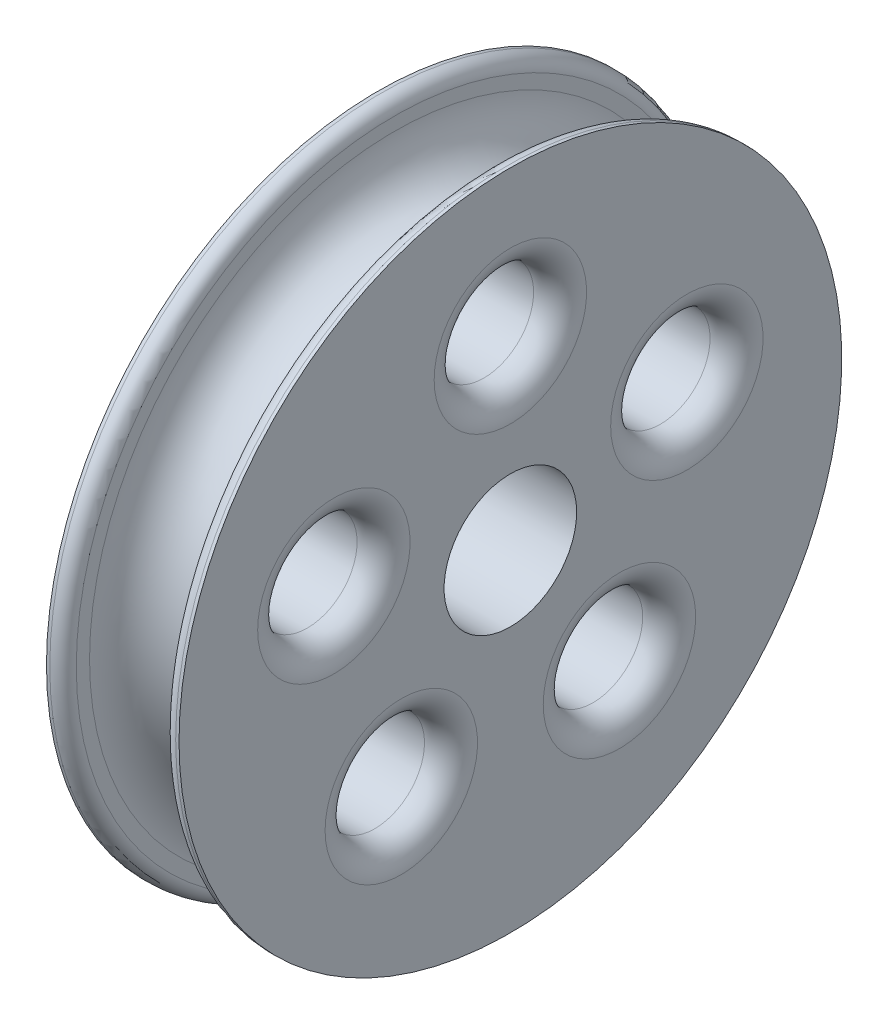
ISO-10303-21;
HEADER;
FILE_DESCRIPTION(('STEP AP214'),'2;1');
FILE_NAME('part.step','',(''),(''),'','','');
FILE_SCHEMA(('AUTOMOTIVE_DESIGN { 1 0 10303 214 1 1 1 1 }'));
ENDSEC;
DATA;
#1=APPLICATION_CONTEXT('core data for automotive mechanical design processes');
#2=APPLICATION_PROTOCOL_DEFINITION('international standard','automotive_design',2000,#1);
#3=PRODUCT_CONTEXT('',#1,'mechanical');
#4=PRODUCT('Part','Part','',(#3));
#5=PRODUCT_RELATED_PRODUCT_CATEGORY('part','',(#4));
#6=PRODUCT_DEFINITION_FORMATION('','',#4);
#7=PRODUCT_DEFINITION_CONTEXT('part definition',#1,'design');
#8=PRODUCT_DEFINITION('design','',#6,#7);
#9=PRODUCT_DEFINITION_SHAPE('','',#8);
#10=(LENGTH_UNIT() NAMED_UNIT(*) SI_UNIT(.MILLI.,.METRE.));
#11=(NAMED_UNIT(*) PLANE_ANGLE_UNIT() SI_UNIT($,.RADIAN.));
#12=(NAMED_UNIT(*) SI_UNIT($,.STERADIAN.) SOLID_ANGLE_UNIT());
#13=UNCERTAINTY_MEASURE_WITH_UNIT(LENGTH_MEASURE(1.E-05),#10,'distance_accuracy_value','');
#14=(GEOMETRIC_REPRESENTATION_CONTEXT(3) GLOBAL_UNCERTAINTY_ASSIGNED_CONTEXT((#13)) GLOBAL_UNIT_ASSIGNED_CONTEXT((#10,
#11,#12)) REPRESENTATION_CONTEXT('',''));
#15=CARTESIAN_POINT('',(0.,0.,0.));
#16=DIRECTION('',(0.,0.,1.));
#17=DIRECTION('',(1.,0.,0.));
#18=AXIS2_PLACEMENT_3D('',#15,#16,#17);
#19=CARTESIAN_POINT('',(-12.7,0.,0.));
#20=DIRECTION('',(1.,0.,0.));
#21=DIRECTION('',(0.,0.,-1.));
#22=AXIS2_PLACEMENT_3D('',#19,#20,#21);
#23=PLANE('',#22);
#24=CARTESIAN_POINT('',(-12.7,0.,0.));
#25=DIRECTION('',(1.,0.,0.));
#26=DIRECTION('',(0.,0.,-1.));
#27=AXIS2_PLACEMENT_3D('',#24,#25,#26);
#28=CIRCLE('',#27,12.7);
#29=CARTESIAN_POINT('',(-12.7,0.,-12.7));
#30=VERTEX_POINT('',#29);
#31=EDGE_CURVE('E157',#30,#30,#28,.T.);
#32=ORIENTED_EDGE('',*,*,#31,.T.);
#33=EDGE_LOOP('',(#32));
#34=FACE_BOUND('',#33,.T.);
#35=CARTESIAN_POINT('',(-12.7,10.9886443199717,33.8195697194546));
#36=DIRECTION('',(1.,0.,0.));
#37=DIRECTION('',(0.,0.,-1.));
#38=AXIS2_PLACEMENT_3D('',#35,#36,#37);
#39=CIRCLE('',#38,14.605);
#40=CARTESIAN_POINT('',(-12.7,10.9886443199717,19.2145697194546));
#41=VERTEX_POINT('',#40);
#42=EDGE_CURVE('E93',#41,#41,#39,.T.);
#43=ORIENTED_EDGE('',*,*,#42,.T.);
#44=EDGE_LOOP('',(#43));
#45=FACE_BOUND('',#44,.T.);
#46=CARTESIAN_POINT('',(-12.7,-28.768644319974,20.9016435715176));
#47=DIRECTION('',(1.,0.,0.));
#48=DIRECTION('',(0.,0.,-1.));
#49=AXIS2_PLACEMENT_3D('',#46,#47,#48);
#50=CIRCLE('',#49,14.605);
#51=CARTESIAN_POINT('',(-12.7,-28.768644319974,6.29664357151761));
#52=VERTEX_POINT('',#51);
#53=EDGE_CURVE('E97',#52,#52,#50,.T.);
#54=ORIENTED_EDGE('',*,*,#53,.T.);
#55=EDGE_LOOP('',(#54));
#56=FACE_BOUND('',#55,.T.);
#57=CARTESIAN_POINT('',(-12.7,-28.7686443199722,-20.9016435715231));
#58=DIRECTION('',(1.,0.,0.));
#59=DIRECTION('',(0.,0.,-1.));
#60=AXIS2_PLACEMENT_3D('',#57,#58,#59);
#61=CIRCLE('',#60,14.605);
#62=CARTESIAN_POINT('',(-12.7,-28.7686443199722,-35.5066435715231));
#63=VERTEX_POINT('',#62);
#64=EDGE_CURVE('E101',#63,#63,#61,.T.);
#65=ORIENTED_EDGE('',*,*,#64,.T.);
#66=EDGE_LOOP('',(#65));
#67=FACE_BOUND('',#66,.T.);
#68=CARTESIAN_POINT('',(-12.7,10.9886443199746,-33.8195697194567));
#69=DIRECTION('',(1.,0.,0.));
#70=DIRECTION('',(0.,0.,-1.));
#71=AXIS2_PLACEMENT_3D('',#68,#69,#70);
#72=CIRCLE('',#71,14.605);
#73=CARTESIAN_POINT('',(-12.7,10.9886443199746,-48.4245697194567));
#74=VERTEX_POINT('',#73);
#75=EDGE_CURVE('E105',#74,#74,#72,.T.);
#76=ORIENTED_EDGE('',*,*,#75,.T.);
#77=EDGE_LOOP('',(#76));
#78=FACE_BOUND('',#77,.T.);
#79=CARTESIAN_POINT('',(-12.7,35.56,0.));
#80=DIRECTION('',(1.,0.,0.));
#81=DIRECTION('',(0.,0.,-1.));
#82=AXIS2_PLACEMENT_3D('',#79,#80,#81);
#83=CIRCLE('',#82,14.605);
#84=CARTESIAN_POINT('',(-12.7,35.56,-14.605));
#85=VERTEX_POINT('',#84);
#86=EDGE_CURVE('E109',#85,#85,#83,.T.);
#87=ORIENTED_EDGE('',*,*,#86,.T.);
#88=EDGE_LOOP('',(#87));
#89=FACE_BOUND('',#88,.T.);
#90=CARTESIAN_POINT('',(-12.7,0.,0.));
#91=DIRECTION('',(-1.,0.,0.));
#92=DIRECTION('',(0.,0.,1.));
#93=AXIS2_PLACEMENT_3D('',#90,#91,#92);
#94=CIRCLE('',#93,63.5);
#95=CARTESIAN_POINT('',(-12.7,0.,63.5));
#96=VERTEX_POINT('',#95);
#97=EDGE_CURVE('E153',#96,#96,#94,.T.);
#98=ORIENTED_EDGE('',*,*,#97,.T.);
#99=EDGE_LOOP('',(#98));
#100=FACE_BOUND('',#99,.T.);
#101=ADVANCED_FACE('F37',(#34,#45,#56,#67,#78,#89,#100),#23,.F.);
#102=CARTESIAN_POINT('',(12.7,0.,0.));
#103=DIRECTION('',(-1.,0.,0.));
#104=DIRECTION('',(0.,0.,1.));
#105=AXIS2_PLACEMENT_3D('',#102,#103,#104);
#106=PLANE('',#105);
#107=CARTESIAN_POINT('',(12.7,0.,0.));
#108=DIRECTION('',(1.,0.,0.));
#109=DIRECTION('',(0.,0.,-1.));
#110=AXIS2_PLACEMENT_3D('',#107,#108,#109);
#111=CIRCLE('',#110,12.7);
#112=CARTESIAN_POINT('',(12.7,0.,-12.7));
#113=VERTEX_POINT('',#112);
#114=EDGE_CURVE('E158',#113,#113,#111,.T.);
#115=ORIENTED_EDGE('',*,*,#114,.F.);
#116=EDGE_LOOP('',(#115));
#117=FACE_BOUND('',#116,.T.);
#118=CARTESIAN_POINT('',(12.7,10.9886443199717,33.8195697194546));
#119=DIRECTION('',(-1.,0.,0.));
#120=DIRECTION('',(0.,0.,1.));
#121=AXIS2_PLACEMENT_3D('',#118,#119,#120);
#122=CIRCLE('',#121,14.605);
#123=CARTESIAN_POINT('',(12.7,10.9886443199717,48.4245697194546));
#124=VERTEX_POINT('',#123);
#125=EDGE_CURVE('E113',#124,#124,#122,.T.);
#126=ORIENTED_EDGE('',*,*,#125,.T.);
#127=EDGE_LOOP('',(#126));
#128=FACE_BOUND('',#127,.T.);
#129=CARTESIAN_POINT('',(12.7,-28.768644319974,20.9016435715176));
#130=DIRECTION('',(-1.,0.,0.));
#131=DIRECTION('',(0.,0.,1.));
#132=AXIS2_PLACEMENT_3D('',#129,#130,#131);
#133=CIRCLE('',#132,14.605);
#134=CARTESIAN_POINT('',(12.7,-28.768644319974,35.5066435715176));
#135=VERTEX_POINT('',#134);
#136=EDGE_CURVE('E117',#135,#135,#133,.T.);
#137=ORIENTED_EDGE('',*,*,#136,.T.);
#138=EDGE_LOOP('',(#137));
#139=FACE_BOUND('',#138,.T.);
#140=CARTESIAN_POINT('',(12.7,-28.7686443199722,-20.9016435715231));
#141=DIRECTION('',(-1.,0.,0.));
#142=DIRECTION('',(0.,0.,1.));
#143=AXIS2_PLACEMENT_3D('',#140,#141,#142);
#144=CIRCLE('',#143,14.605);
#145=CARTESIAN_POINT('',(12.7,-28.7686443199722,-6.29664357152308));
#146=VERTEX_POINT('',#145);
#147=EDGE_CURVE('E121',#146,#146,#144,.T.);
#148=ORIENTED_EDGE('',*,*,#147,.T.);
#149=EDGE_LOOP('',(#148));
#150=FACE_BOUND('',#149,.T.);
#151=CARTESIAN_POINT('',(12.7,10.9886443199746,-33.8195697194567));
#152=DIRECTION('',(-1.,0.,0.));
#153=DIRECTION('',(0.,0.,1.));
#154=AXIS2_PLACEMENT_3D('',#151,#152,#153);
#155=CIRCLE('',#154,14.605);
#156=CARTESIAN_POINT('',(12.7,10.9886443199746,-19.2145697194567));
#157=VERTEX_POINT('',#156);
#158=EDGE_CURVE('E125',#157,#157,#155,.T.);
#159=ORIENTED_EDGE('',*,*,#158,.T.);
#160=EDGE_LOOP('',(#159));
#161=FACE_BOUND('',#160,.T.);
#162=CARTESIAN_POINT('',(12.7,35.56,0.));
#163=DIRECTION('',(-1.,0.,0.));
#164=DIRECTION('',(0.,0.,1.));
#165=AXIS2_PLACEMENT_3D('',#162,#163,#164);
#166=CIRCLE('',#165,14.605);
#167=CARTESIAN_POINT('',(12.7,35.56,14.605));
#168=VERTEX_POINT('',#167);
#169=EDGE_CURVE('E129',#168,#168,#166,.T.);
#170=ORIENTED_EDGE('',*,*,#169,.T.);
#171=EDGE_LOOP('',(#170));
#172=FACE_BOUND('',#171,.T.);
#173=CARTESIAN_POINT('',(12.7,0.,0.));
#174=DIRECTION('',(-1.,0.,0.));
#175=DIRECTION('',(0.,0.,1.));
#176=AXIS2_PLACEMENT_3D('',#173,#174,#175);
#177=CIRCLE('',#176,63.5);
#178=CARTESIAN_POINT('',(12.7,0.,63.5));
#179=VERTEX_POINT('',#178);
#180=EDGE_CURVE('E141',#179,#179,#177,.T.);
#181=ORIENTED_EDGE('',*,*,#180,.F.);
#182=EDGE_LOOP('',(#181));
#183=FACE_BOUND('',#182,.T.);
#184=ADVANCED_FACE('F174',(#117,#128,#139,#150,#161,#172,#183),#106,.F.);
#185=CARTESIAN_POINT('',(-12.7,0.,0.));
#186=DIRECTION('',(-1.,0.,0.));
#187=DIRECTION('',(0.,0.,1.));
#188=AXIS2_PLACEMENT_3D('',#185,#186,#187);
#189=CYLINDRICAL_SURFACE('',#188,63.5);
#190=CARTESIAN_POINT('',(12.065,0.,0.));
#191=DIRECTION('',(1.,0.,0.));
#192=DIRECTION('',(0.,0.,-1.));
#193=AXIS2_PLACEMENT_3D('',#190,#191,#192);
#194=CIRCLE('',#193,63.5);
#195=CARTESIAN_POINT('',(12.065,0.,-63.5));
#196=VERTEX_POINT('',#195);
#197=EDGE_CURVE('E10',#196,#196,#194,.T.);
#198=ORIENTED_EDGE('',*,*,#197,.T.);
#199=EDGE_LOOP('',(#198));
#200=FACE_BOUND('',#199,.T.);
#201=ORIENTED_EDGE('',*,*,#180,.T.);
#202=EDGE_LOOP('',(#201));
#203=FACE_BOUND('',#202,.T.);
#204=ADVANCED_FACE('F177',(#200,#203),#189,.T.);
#205=CARTESIAN_POINT('',(9.525,58.42,0.));
#206=DIRECTION('',(1.,0.,0.));
#207=DIRECTION('',(0.,0.,-1.));
#208=AXIS2_PLACEMENT_3D('',#205,#206,#207);
#209=PLANE('',#208);
#210=CARTESIAN_POINT('',(9.525,0.,0.));
#211=DIRECTION('',(1.,0.,0.));
#212=DIRECTION('',(0.,0.,-1.));
#213=AXIS2_PLACEMENT_3D('',#210,#211,#212);
#214=CIRCLE('',#213,60.96);
#215=CARTESIAN_POINT('',(9.525,0.,-60.96));
#216=VERTEX_POINT('',#215);
#217=EDGE_CURVE('E45',#216,#216,#214,.F.);
#218=ORIENTED_EDGE('',*,*,#217,.T.);
#219=EDGE_LOOP('',(#218));
#220=FACE_BOUND('',#219,.T.);
#221=CARTESIAN_POINT('',(9.525,0.,0.));
#222=DIRECTION('',(-1.,0.,0.));
#223=DIRECTION('',(0.,0.,1.));
#224=AXIS2_PLACEMENT_3D('',#221,#222,#223);
#225=CIRCLE('',#224,58.42);
#226=CARTESIAN_POINT('',(9.525,0.,58.42));
#227=VERTEX_POINT('',#226);
#228=EDGE_CURVE('E145',#227,#227,#225,.T.);
#229=ORIENTED_EDGE('',*,*,#228,.F.);
#230=EDGE_LOOP('',(#229));
#231=FACE_BOUND('',#230,.T.);
#232=ADVANCED_FACE('F192',(#220,#231),#209,.F.);
#233=CARTESIAN_POINT('',(0.,0.,0.));
#234=DIRECTION('',(-1.,0.,0.));
#235=DIRECTION('',(0.,0.,1.));
#236=AXIS2_PLACEMENT_3D('',#233,#234,#235);
#237=TOROIDAL_SURFACE('',#236,58.42,9.525);
#238=CARTESIAN_POINT('',(-9.52499999999999,0.,0.));
#239=DIRECTION('',(-1.,0.,0.));
#240=DIRECTION('',(0.,0.,1.));
#241=AXIS2_PLACEMENT_3D('',#238,#239,#240);
#242=CIRCLE('',#241,58.42);
#243=CARTESIAN_POINT('',(-9.52499999999999,0.,58.42));
#244=VERTEX_POINT('',#243);
#245=EDGE_CURVE('E149',#244,#244,#242,.T.);
#246=ORIENTED_EDGE('',*,*,#245,.F.);
#247=EDGE_LOOP('',(#246));
#248=FACE_BOUND('',#247,.T.);
#249=ORIENTED_EDGE('',*,*,#228,.T.);
#250=EDGE_LOOP('',(#249));
#251=FACE_BOUND('',#250,.T.);
#252=ADVANCED_FACE('F197',(#248,#251),#237,.F.);
#253=CARTESIAN_POINT('',(-9.52499999999999,58.42,0.));
#254=DIRECTION('',(-1.,0.,0.));
#255=DIRECTION('',(0.,0.,1.));
#256=AXIS2_PLACEMENT_3D('',#253,#254,#255);
#257=PLANE('',#256);
#258=CARTESIAN_POINT('',(-9.52499999999999,0.,0.));
#259=DIRECTION('',(-1.,0.,0.));
#260=DIRECTION('',(0.,0.,1.));
#261=AXIS2_PLACEMENT_3D('',#258,#259,#260);
#262=CIRCLE('',#261,60.96);
#263=CARTESIAN_POINT('',(-9.52499999999999,0.,60.96));
#264=VERTEX_POINT('',#263);
#265=EDGE_CURVE('E50',#264,#264,#262,.F.);
#266=ORIENTED_EDGE('',*,*,#265,.T.);
#267=EDGE_LOOP('',(#266));
#268=FACE_BOUND('',#267,.T.);
#269=ORIENTED_EDGE('',*,*,#245,.T.);
#270=EDGE_LOOP('',(#269));
#271=FACE_BOUND('',#270,.T.);
#272=ADVANCED_FACE('F259',(#268,#271),#257,.F.);
#273=CARTESIAN_POINT('',(-12.7,0.,0.));
#274=DIRECTION('',(-1.,0.,0.));
#275=DIRECTION('',(0.,0.,1.));
#276=AXIS2_PLACEMENT_3D('',#273,#274,#275);
#277=CYLINDRICAL_SURFACE('',#276,63.5);
#278=CARTESIAN_POINT('',(-12.065,0.,0.));
#279=DIRECTION('',(-1.,0.,0.));
#280=DIRECTION('',(0.,0.,1.));
#281=AXIS2_PLACEMENT_3D('',#278,#279,#280);
#282=CIRCLE('',#281,63.5);
#283=CARTESIAN_POINT('',(-12.065,0.,63.5));
#284=VERTEX_POINT('',#283);
#285=EDGE_CURVE('E55',#284,#284,#282,.T.);
#286=ORIENTED_EDGE('',*,*,#285,.T.);
#287=EDGE_LOOP('',(#286));
#288=FACE_BOUND('',#287,.T.);
#289=ORIENTED_EDGE('',*,*,#97,.F.);
#290=EDGE_LOOP('',(#289));
#291=FACE_BOUND('',#290,.T.);
#292=ADVANCED_FACE('F255',(#288,#291),#277,.T.);
#293=CARTESIAN_POINT('',(-12.7,10.9886443199717,33.8195697194546));
#294=DIRECTION('',(1.,0.,0.));
#295=DIRECTION('',(0.,0.,-1.));
#296=AXIS2_PLACEMENT_3D('',#293,#294,#295);
#297=CYLINDRICAL_SURFACE('',#296,9.52500000000001);
#298=CARTESIAN_POINT('',(7.62,10.9886443199717,33.8195697194546));
#299=DIRECTION('',(-1.,0.,0.));
#300=DIRECTION('',(0.,0.,1.));
#301=AXIS2_PLACEMENT_3D('',#298,#299,#300);
#302=CIRCLE('',#301,9.52500000000001);
#303=CARTESIAN_POINT('',(7.62,10.9886443199717,43.3445697194546));
#304=VERTEX_POINT('',#303);
#305=EDGE_CURVE('E133',#304,#304,#302,.F.);
#306=ORIENTED_EDGE('',*,*,#305,.T.);
#307=EDGE_LOOP('',(#306));
#308=FACE_BOUND('',#307,.T.);
#309=CARTESIAN_POINT('',(-7.62,10.9886443199717,33.8195697194546));
#310=DIRECTION('',(1.,0.,0.));
#311=DIRECTION('',(0.,0.,-1.));
#312=AXIS2_PLACEMENT_3D('',#309,#310,#311);
#313=CIRCLE('',#312,9.52500000000001);
#314=CARTESIAN_POINT('',(-7.62,10.9886443199717,24.2945697194546));
#315=VERTEX_POINT('',#314);
#316=EDGE_CURVE('E137',#315,#315,#313,.F.);
#317=ORIENTED_EDGE('',*,*,#316,.T.);
#318=EDGE_LOOP('',(#317));
#319=FACE_BOUND('',#318,.T.);
#320=ADVANCED_FACE('F258',(#308,#319),#297,.F.);
#321=CARTESIAN_POINT('',(-12.7,-28.768644319974,20.9016435715176));
#322=DIRECTION('',(1.,0.,0.));
#323=DIRECTION('',(0.,0.,-1.));
#324=AXIS2_PLACEMENT_3D('',#321,#322,#323);
#325=CYLINDRICAL_SURFACE('',#324,9.525);
#326=CARTESIAN_POINT('',(7.62,-28.768644319974,20.9016435715176));
#327=DIRECTION('',(-1.,0.,0.));
#328=DIRECTION('',(0.,0.,1.));
#329=AXIS2_PLACEMENT_3D('',#326,#327,#328);
#330=CIRCLE('',#329,9.525);
#331=CARTESIAN_POINT('',(7.62,-28.768644319974,30.4266435715176));
#332=VERTEX_POINT('',#331);
#333=EDGE_CURVE('E85',#332,#332,#330,.F.);
#334=ORIENTED_EDGE('',*,*,#333,.T.);
#335=EDGE_LOOP('',(#334));
#336=FACE_BOUND('',#335,.T.);
#337=CARTESIAN_POINT('',(-7.62,-28.768644319974,20.9016435715176));
#338=DIRECTION('',(1.,0.,0.));
#339=DIRECTION('',(0.,0.,-1.));
#340=AXIS2_PLACEMENT_3D('',#337,#338,#339);
#341=CIRCLE('',#340,9.525);
#342=CARTESIAN_POINT('',(-7.62,-28.768644319974,11.3766435715176));
#343=VERTEX_POINT('',#342);
#344=EDGE_CURVE('E89',#343,#343,#341,.F.);
#345=ORIENTED_EDGE('',*,*,#344,.T.);
#346=EDGE_LOOP('',(#345));
#347=FACE_BOUND('',#346,.T.);
#348=ADVANCED_FACE('F267',(#336,#347),#325,.F.);
#349=CARTESIAN_POINT('',(-12.7,-28.7686443199722,-20.9016435715231));
#350=DIRECTION('',(1.,0.,0.));
#351=DIRECTION('',(0.,0.,-1.));
#352=AXIS2_PLACEMENT_3D('',#349,#350,#351);
#353=CYLINDRICAL_SURFACE('',#352,9.525);
#354=CARTESIAN_POINT('',(7.62,-28.7686443199722,-20.9016435715231));
#355=DIRECTION('',(-1.,0.,0.));
#356=DIRECTION('',(0.,0.,1.));
#357=AXIS2_PLACEMENT_3D('',#354,#355,#356);
#358=CIRCLE('',#357,9.525);
#359=CARTESIAN_POINT('',(7.62,-28.7686443199722,-11.3766435715231));
#360=VERTEX_POINT('',#359);
#361=EDGE_CURVE('E77',#360,#360,#358,.F.);
#362=ORIENTED_EDGE('',*,*,#361,.T.);
#363=EDGE_LOOP('',(#362));
#364=FACE_BOUND('',#363,.T.);
#365=CARTESIAN_POINT('',(-7.62,-28.7686443199722,-20.9016435715231));
#366=DIRECTION('',(1.,0.,0.));
#367=DIRECTION('',(0.,0.,-1.));
#368=AXIS2_PLACEMENT_3D('',#365,#366,#367);
#369=CIRCLE('',#368,9.525);
#370=CARTESIAN_POINT('',(-7.62,-28.7686443199722,-30.4266435715231));
#371=VERTEX_POINT('',#370);
#372=EDGE_CURVE('E81',#371,#371,#369,.F.);
#373=ORIENTED_EDGE('',*,*,#372,.T.);
#374=EDGE_LOOP('',(#373));
#375=FACE_BOUND('',#374,.T.);
#376=ADVANCED_FACE('F410',(#364,#375),#353,.F.);
#377=CARTESIAN_POINT('',(-12.7,10.9886443199746,-33.8195697194567));
#378=DIRECTION('',(1.,0.,0.));
#379=DIRECTION('',(0.,0.,-1.));
#380=AXIS2_PLACEMENT_3D('',#377,#378,#379);
#381=CYLINDRICAL_SURFACE('',#380,9.52500000000001);
#382=CARTESIAN_POINT('',(7.62,10.9886443199746,-33.8195697194567));
#383=DIRECTION('',(-1.,0.,0.));
#384=DIRECTION('',(0.,0.,1.));
#385=AXIS2_PLACEMENT_3D('',#382,#383,#384);
#386=CIRCLE('',#385,9.52500000000001);
#387=CARTESIAN_POINT('',(7.62,10.9886443199746,-24.2945697194567));
#388=VERTEX_POINT('',#387);
#389=EDGE_CURVE('E69',#388,#388,#386,.F.);
#390=ORIENTED_EDGE('',*,*,#389,.T.);
#391=EDGE_LOOP('',(#390));
#392=FACE_BOUND('',#391,.T.);
#393=CARTESIAN_POINT('',(-7.62,10.9886443199746,-33.8195697194567));
#394=DIRECTION('',(1.,0.,0.));
#395=DIRECTION('',(0.,0.,-1.));
#396=AXIS2_PLACEMENT_3D('',#393,#394,#395);
#397=CIRCLE('',#396,9.52500000000001);
#398=CARTESIAN_POINT('',(-7.62,10.9886443199746,-43.3445697194567));
#399=VERTEX_POINT('',#398);
#400=EDGE_CURVE('E73',#399,#399,#397,.F.);
#401=ORIENTED_EDGE('',*,*,#400,.T.);
#402=EDGE_LOOP('',(#401));
#403=FACE_BOUND('',#402,.T.);
#404=ADVANCED_FACE('F400',(#392,#403),#381,.F.);
#405=CARTESIAN_POINT('',(-12.7,35.56,0.));
#406=DIRECTION('',(1.,0.,0.));
#407=DIRECTION('',(0.,0.,-1.));
#408=AXIS2_PLACEMENT_3D('',#405,#406,#407);
#409=CYLINDRICAL_SURFACE('',#408,9.525);
#410=CARTESIAN_POINT('',(7.62,35.56,0.));
#411=DIRECTION('',(-1.,0.,0.));
#412=DIRECTION('',(0.,0.,1.));
#413=AXIS2_PLACEMENT_3D('',#410,#411,#412);
#414=CIRCLE('',#413,9.525);
#415=CARTESIAN_POINT('',(7.62,35.56,9.52499999999999));
#416=VERTEX_POINT('',#415);
#417=EDGE_CURVE('E61',#416,#416,#414,.F.);
#418=ORIENTED_EDGE('',*,*,#417,.T.);
#419=EDGE_LOOP('',(#418));
#420=FACE_BOUND('',#419,.T.);
#421=CARTESIAN_POINT('',(-7.62,35.56,0.));
#422=DIRECTION('',(1.,0.,0.));
#423=DIRECTION('',(0.,0.,-1.));
#424=AXIS2_PLACEMENT_3D('',#421,#422,#423);
#425=CIRCLE('',#424,9.525);
#426=CARTESIAN_POINT('',(-7.62,35.56,-9.525));
#427=VERTEX_POINT('',#426);
#428=EDGE_CURVE('E65',#427,#427,#425,.F.);
#429=ORIENTED_EDGE('',*,*,#428,.T.);
#430=EDGE_LOOP('',(#429));
#431=FACE_BOUND('',#430,.T.);
#432=ADVANCED_FACE('F208',(#420,#431),#409,.F.);
#433=CARTESIAN_POINT('',(7.62,10.9886443199717,33.8195697194546));
#434=DIRECTION('',(-1.,0.,0.));
#435=DIRECTION('',(0.,0.,1.));
#436=AXIS2_PLACEMENT_3D('',#433,#434,#435);
#437=TOROIDAL_SURFACE('',#436,14.605,5.08);
#438=ORIENTED_EDGE('',*,*,#125,.F.);
#439=EDGE_LOOP('',(#438));
#440=FACE_BOUND('',#439,.T.);
#441=ORIENTED_EDGE('',*,*,#305,.F.);
#442=EDGE_LOOP('',(#441));
#443=FACE_BOUND('',#442,.T.);
#444=ADVANCED_FACE('F204',(#440,#443),#437,.T.);
#445=CARTESIAN_POINT('',(-7.62,10.9886443199717,33.8195697194546));
#446=DIRECTION('',(1.,0.,0.));
#447=DIRECTION('',(0.,0.,-1.));
#448=AXIS2_PLACEMENT_3D('',#445,#446,#447);
#449=TOROIDAL_SURFACE('',#448,14.605,5.08);
#450=ORIENTED_EDGE('',*,*,#316,.F.);
#451=EDGE_LOOP('',(#450));
#452=FACE_BOUND('',#451,.T.);
#453=ORIENTED_EDGE('',*,*,#42,.F.);
#454=EDGE_LOOP('',(#453));
#455=FACE_BOUND('',#454,.T.);
#456=ADVANCED_FACE('F207',(#452,#455),#449,.T.);
#457=CARTESIAN_POINT('',(7.62,-28.768644319974,20.9016435715176));
#458=DIRECTION('',(-1.,0.,0.));
#459=DIRECTION('',(0.,0.,1.));
#460=AXIS2_PLACEMENT_3D('',#457,#458,#459);
#461=TOROIDAL_SURFACE('',#460,14.605,5.08);
#462=ORIENTED_EDGE('',*,*,#136,.F.);
#463=EDGE_LOOP('',(#462));
#464=FACE_BOUND('',#463,.T.);
#465=ORIENTED_EDGE('',*,*,#333,.F.);
#466=EDGE_LOOP('',(#465));
#467=FACE_BOUND('',#466,.T.);
#468=ADVANCED_FACE('F212',(#464,#467),#461,.T.);
#469=CARTESIAN_POINT('',(-7.62,-28.768644319974,20.9016435715176));
#470=DIRECTION('',(1.,0.,0.));
#471=DIRECTION('',(0.,0.,-1.));
#472=AXIS2_PLACEMENT_3D('',#469,#470,#471);
#473=TOROIDAL_SURFACE('',#472,14.605,5.08);
#474=ORIENTED_EDGE('',*,*,#344,.F.);
#475=EDGE_LOOP('',(#474));
#476=FACE_BOUND('',#475,.T.);
#477=ORIENTED_EDGE('',*,*,#53,.F.);
#478=EDGE_LOOP('',(#477));
#479=FACE_BOUND('',#478,.T.);
#480=ADVANCED_FACE('F216',(#476,#479),#473,.T.);
#481=CARTESIAN_POINT('',(7.62,-28.7686443199722,-20.9016435715231));
#482=DIRECTION('',(-1.,0.,0.));
#483=DIRECTION('',(0.,0.,1.));
#484=AXIS2_PLACEMENT_3D('',#481,#482,#483);
#485=TOROIDAL_SURFACE('',#484,14.605,5.08);
#486=ORIENTED_EDGE('',*,*,#147,.F.);
#487=EDGE_LOOP('',(#486));
#488=FACE_BOUND('',#487,.T.);
#489=ORIENTED_EDGE('',*,*,#361,.F.);
#490=EDGE_LOOP('',(#489));
#491=FACE_BOUND('',#490,.T.);
#492=ADVANCED_FACE('F220',(#488,#491),#485,.T.);
#493=CARTESIAN_POINT('',(-7.62,-28.7686443199722,-20.9016435715231));
#494=DIRECTION('',(1.,0.,0.));
#495=DIRECTION('',(0.,0.,-1.));
#496=AXIS2_PLACEMENT_3D('',#493,#494,#495);
#497=TOROIDAL_SURFACE('',#496,14.605,5.08);
#498=ORIENTED_EDGE('',*,*,#372,.F.);
#499=EDGE_LOOP('',(#498));
#500=FACE_BOUND('',#499,.T.);
#501=ORIENTED_EDGE('',*,*,#64,.F.);
#502=EDGE_LOOP('',(#501));
#503=FACE_BOUND('',#502,.T.);
#504=ADVANCED_FACE('F224',(#500,#503),#497,.T.);
#505=CARTESIAN_POINT('',(7.62,10.9886443199746,-33.8195697194567));
#506=DIRECTION('',(-1.,0.,0.));
#507=DIRECTION('',(0.,0.,1.));
#508=AXIS2_PLACEMENT_3D('',#505,#506,#507);
#509=TOROIDAL_SURFACE('',#508,14.605,5.08);
#510=ORIENTED_EDGE('',*,*,#158,.F.);
#511=EDGE_LOOP('',(#510));
#512=FACE_BOUND('',#511,.T.);
#513=ORIENTED_EDGE('',*,*,#389,.F.);
#514=EDGE_LOOP('',(#513));
#515=FACE_BOUND('',#514,.T.);
#516=ADVANCED_FACE('F228',(#512,#515),#509,.T.);
#517=CARTESIAN_POINT('',(-7.62,10.9886443199746,-33.8195697194567));
#518=DIRECTION('',(1.,0.,0.));
#519=DIRECTION('',(0.,0.,-1.));
#520=AXIS2_PLACEMENT_3D('',#517,#518,#519);
#521=TOROIDAL_SURFACE('',#520,14.605,5.08);
#522=ORIENTED_EDGE('',*,*,#400,.F.);
#523=EDGE_LOOP('',(#522));
#524=FACE_BOUND('',#523,.T.);
#525=ORIENTED_EDGE('',*,*,#75,.F.);
#526=EDGE_LOOP('',(#525));
#527=FACE_BOUND('',#526,.T.);
#528=ADVANCED_FACE('F232',(#524,#527),#521,.T.);
#529=CARTESIAN_POINT('',(7.62,35.56,0.));
#530=DIRECTION('',(-1.,0.,0.));
#531=DIRECTION('',(0.,0.,1.));
#532=AXIS2_PLACEMENT_3D('',#529,#530,#531);
#533=TOROIDAL_SURFACE('',#532,14.605,5.08);
#534=ORIENTED_EDGE('',*,*,#169,.F.);
#535=EDGE_LOOP('',(#534));
#536=FACE_BOUND('',#535,.T.);
#537=ORIENTED_EDGE('',*,*,#417,.F.);
#538=EDGE_LOOP('',(#537));
#539=FACE_BOUND('',#538,.T.);
#540=ADVANCED_FACE('F236',(#536,#539),#533,.T.);
#541=CARTESIAN_POINT('',(-7.62,35.56,0.));
#542=DIRECTION('',(1.,0.,0.));
#543=DIRECTION('',(0.,0.,-1.));
#544=AXIS2_PLACEMENT_3D('',#541,#542,#543);
#545=TOROIDAL_SURFACE('',#544,14.605,5.08);
#546=ORIENTED_EDGE('',*,*,#428,.F.);
#547=EDGE_LOOP('',(#546));
#548=FACE_BOUND('',#547,.T.);
#549=ORIENTED_EDGE('',*,*,#86,.F.);
#550=EDGE_LOOP('',(#549));
#551=FACE_BOUND('',#550,.T.);
#552=ADVANCED_FACE('F240',(#548,#551),#545,.T.);
#553=CARTESIAN_POINT('',(-12.065,0.,0.));
#554=DIRECTION('',(-1.,0.,0.));
#555=DIRECTION('',(0.,0.,1.));
#556=AXIS2_PLACEMENT_3D('',#553,#554,#555);
#557=TOROIDAL_SURFACE('',#556,60.96,2.54);
#558=ORIENTED_EDGE('',*,*,#265,.F.);
#559=EDGE_LOOP('',(#558));
#560=FACE_BOUND('',#559,.T.);
#561=ORIENTED_EDGE('',*,*,#285,.F.);
#562=EDGE_LOOP('',(#561));
#563=FACE_BOUND('',#562,.T.);
#564=ADVANCED_FACE('F243',(#560,#563),#557,.T.);
#565=CARTESIAN_POINT('',(12.065,0.,0.));
#566=DIRECTION('',(1.,0.,0.));
#567=DIRECTION('',(0.,0.,-1.));
#568=AXIS2_PLACEMENT_3D('',#565,#566,#567);
#569=TOROIDAL_SURFACE('',#568,60.96,2.54);
#570=ORIENTED_EDGE('',*,*,#197,.F.);
#571=EDGE_LOOP('',(#570));
#572=FACE_BOUND('',#571,.T.);
#573=ORIENTED_EDGE('',*,*,#217,.F.);
#574=EDGE_LOOP('',(#573));
#575=FACE_BOUND('',#574,.T.);
#576=ADVANCED_FACE('F39',(#572,#575),#569,.T.);
#577=CARTESIAN_POINT('',(-12.7,0.,0.));
#578=DIRECTION('',(1.,0.,0.));
#579=DIRECTION('',(0.,0.,-1.));
#580=AXIS2_PLACEMENT_3D('',#577,#578,#579);
#581=CYLINDRICAL_SURFACE('',#580,12.7);
#582=ORIENTED_EDGE('',*,*,#31,.F.);
#583=EDGE_LOOP('',(#582));
#584=FACE_BOUND('',#583,.T.);
#585=ORIENTED_EDGE('',*,*,#114,.T.);
#586=EDGE_LOOP('',(#585));
#587=FACE_BOUND('',#586,.T.);
#588=ADVANCED_FACE('F168',(#584,#587),#581,.F.);
#589=CLOSED_SHELL('',(#101,#184,#204,#232,#252,#272,#292,#320,#348,#376,#404,#432,#444,#456,
#468,#480,#492,#504,#516,#528,#540,#552,#564,#576,#588));
#590=MANIFOLD_SOLID_BREP('B2',#589);
#591=ADVANCED_BREP_SHAPE_REPRESENTATION('',(#18,#590),#14);
#592=SHAPE_DEFINITION_REPRESENTATION(#9,#591);
ENDSEC;
END-ISO-10303-21;
